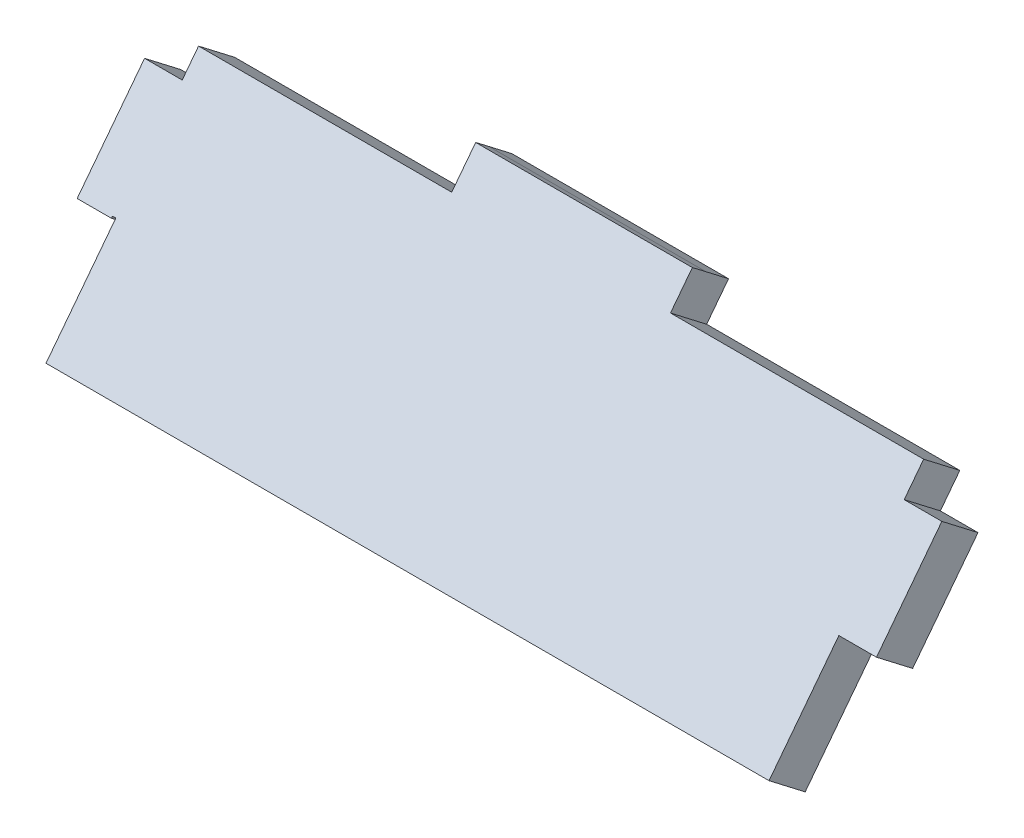
ISO-10303-21;
HEADER;
FILE_DESCRIPTION(('STEP AP214'),'2;1');
FILE_NAME('part.step','',(''),(''),'','','');
FILE_SCHEMA(('AUTOMOTIVE_DESIGN { 1 0 10303 214 1 1 1 1 }'));
ENDSEC;
DATA;
#1=APPLICATION_CONTEXT('core data for automotive mechanical design processes');
#2=APPLICATION_PROTOCOL_DEFINITION('international standard','automotive_design',2000,#1);
#3=PRODUCT_CONTEXT('',#1,'mechanical');
#4=PRODUCT('Part','Part','',(#3));
#5=PRODUCT_RELATED_PRODUCT_CATEGORY('part','',(#4));
#6=PRODUCT_DEFINITION_FORMATION('','',#4);
#7=PRODUCT_DEFINITION_CONTEXT('part definition',#1,'design');
#8=PRODUCT_DEFINITION('design','',#6,#7);
#9=PRODUCT_DEFINITION_SHAPE('','',#8);
#10=(LENGTH_UNIT() NAMED_UNIT(*) SI_UNIT(.MILLI.,.METRE.));
#11=(NAMED_UNIT(*) PLANE_ANGLE_UNIT() SI_UNIT($,.RADIAN.));
#12=(NAMED_UNIT(*) SI_UNIT($,.STERADIAN.) SOLID_ANGLE_UNIT());
#13=UNCERTAINTY_MEASURE_WITH_UNIT(LENGTH_MEASURE(1.E-05),#10,'distance_accuracy_value','');
#14=(GEOMETRIC_REPRESENTATION_CONTEXT(3) GLOBAL_UNCERTAINTY_ASSIGNED_CONTEXT((#13)) GLOBAL_UNIT_ASSIGNED_CONTEXT((#10,
#11,#12)) REPRESENTATION_CONTEXT('',''));
#15=CARTESIAN_POINT('',(0.,0.,0.));
#16=DIRECTION('',(0.,0.,1.));
#17=DIRECTION('',(1.,0.,0.));
#18=AXIS2_PLACEMENT_3D('',#15,#16,#17);
#19=CARTESIAN_POINT('',(-285.200000000001,78.6438868512443,-60.4630387999879));
#20=DIRECTION('',(1.,0.,0.));
#21=DIRECTION('',(0.,0.,-1.));
#22=AXIS2_PLACEMENT_3D('',#19,#20,#21);
#23=PLANE('',#22);
#24=DIRECTION('',(0.,0.792781117452051,-0.609506439516005));
#25=VECTOR('',#24,1.);
#26=CARTESIAN_POINT('',(-285.200000000001,197.680360461686,94.3669391102944));
#27=LINE('',#26,#25);
#28=CARTESIAN_POINT('',(-285.200000000001,197.799277629303,94.275513144367));
#29=VERTEX_POINT('',#28);
#30=CARTESIAN_POINT('',(-285.200000000001,200.296538149277,92.3555678598922));
#31=VERTEX_POINT('',#30);
#32=EDGE_CURVE('E192',#29,#31,#27,.T.);
#33=ORIENTED_EDGE('',*,*,#32,.T.);
#34=DIRECTION('',(0.,-0.609506439516001,-0.792781117452054));
#35=VECTOR('',#34,1.);
#36=CARTESIAN_POINT('',(-285.200000000001,81.2600645388356,-62.4744100503903));
#37=LINE('',#36,#35);
#38=CARTESIAN_POINT('',(-285.200000000001,201.833533007389,94.3547272159438));
#39=VERTEX_POINT('',#38);
#40=EDGE_CURVE('E232',#39,#31,#37,.T.);
#41=ORIENTED_EDGE('',*,*,#40,.F.);
#42=CARTESIAN_POINT('',(-285.200000000001,4.97086643496067,245.706796954713));
#43=DIRECTION('',(1.,0.,0.));
#44=DIRECTION('',(0.,0.,-1.));
#45=AXIS2_PLACEMENT_3D('',#42,#43,#44);
#46=CIRCLE('',#45,248.319065929736);
#47=CARTESIAN_POINT('',(-285.200000000001,202.731075398266,95.5293743672744));
#48=VERTEX_POINT('',#47);
#49=EDGE_CURVE('E226',#48,#39,#46,.F.);
#50=ORIENTED_EDGE('',*,*,#49,.F.);
#51=DIRECTION('',(0.,0.792781117452051,-0.609506439516005));
#52=VECTOR('',#51,1.);
#53=CARTESIAN_POINT('',(-285.200000000001,200.11838621975,97.5380635801026));
#54=LINE('',#53,#52);
#55=CARTESIAN_POINT('',(-285.200000000001,200.237303387367,97.4466376141751));
#56=VERTEX_POINT('',#55);
#57=EDGE_CURVE('E203',#56,#48,#54,.T.);
#58=ORIENTED_EDGE('',*,*,#57,.F.);
#59=DIRECTION('',(0.,0.609506439516005,0.792781117452051));
#60=VECTOR('',#59,1.);
#61=CARTESIAN_POINT('',(-285.200000000001,197.799277629303,94.2755131443669));
#62=LINE('',#61,#60);
#63=EDGE_CURVE('E213',#29,#56,#62,.T.);
#64=ORIENTED_EDGE('',*,*,#63,.F.);
#65=EDGE_LOOP('',(#33,#41,#50,#58,#64));
#66=FACE_BOUND('',#65,.T.);
#67=ADVANCED_FACE('F41',(#66),#23,.T.);
#68=CARTESIAN_POINT('',(-304.199999999999,78.6438868512443,-60.4630387999879));
#69=DIRECTION('',(-1.,0.,0.));
#70=DIRECTION('',(0.,0.,1.));
#71=AXIS2_PLACEMENT_3D('',#68,#69,#70);
#72=PLANE('',#71);
#73=DIRECTION('',(0.,0.792781117452051,-0.609506439516005));
#74=VECTOR('',#73,1.);
#75=CARTESIAN_POINT('',(-304.199999999999,200.11838621975,97.5380635801026));
#76=LINE('',#75,#74);
#77=CARTESIAN_POINT('',(-304.199999999999,199.999469052132,97.6294895460299));
#78=VERTEX_POINT('',#77);
#79=CARTESIAN_POINT('',(-304.199999999999,202.731075398266,95.5293743672744));
#80=VERTEX_POINT('',#79);
#81=EDGE_CURVE('E195',#78,#80,#76,.T.);
#82=ORIENTED_EDGE('',*,*,#81,.T.);
#83=CARTESIAN_POINT('',(-304.199999999999,4.97086643496067,245.706796954713));
#84=DIRECTION('',(-1.,0.,0.));
#85=DIRECTION('',(0.,0.,1.));
#86=AXIS2_PLACEMENT_3D('',#83,#84,#85);
#87=CIRCLE('',#86,248.319065929736);
#88=CARTESIAN_POINT('',(-304.199999999999,201.833533007389,94.3547272159435));
#89=VERTEX_POINT('',#88);
#90=EDGE_CURVE('E50',#89,#80,#87,.F.);
#91=ORIENTED_EDGE('',*,*,#90,.F.);
#92=DIRECTION('',(0.,0.609506439516001,0.792781117452054));
#93=VECTOR('',#92,1.);
#94=CARTESIAN_POINT('',(-304.199999999999,81.2600645388356,-62.4744100503903));
#95=LINE('',#94,#93);
#96=CARTESIAN_POINT('',(-304.199999999999,200.296538149277,92.3555678598922));
#97=VERTEX_POINT('',#96);
#98=EDGE_CURVE('E11',#97,#89,#95,.T.);
#99=ORIENTED_EDGE('',*,*,#98,.F.);
#100=DIRECTION('',(0.,0.792781117452051,-0.609506439516005));
#101=VECTOR('',#100,1.);
#102=CARTESIAN_POINT('',(-304.199999999999,197.680360461686,94.3669391102944));
#103=LINE('',#102,#101);
#104=CARTESIAN_POINT('',(-304.199999999999,197.561443294068,94.4583650762217));
#105=VERTEX_POINT('',#104);
#106=EDGE_CURVE('E204',#105,#97,#103,.T.);
#107=ORIENTED_EDGE('',*,*,#106,.F.);
#108=DIRECTION('',(0.,-0.609506439516005,-0.792781117452051));
#109=VECTOR('',#108,1.);
#110=CARTESIAN_POINT('',(-304.199999999999,197.561443294068,94.4583650762217));
#111=LINE('',#110,#109);
#112=EDGE_CURVE('E185',#78,#105,#111,.T.);
#113=ORIENTED_EDGE('',*,*,#112,.F.);
#114=EDGE_LOOP('',(#82,#91,#99,#107,#113));
#115=FACE_BOUND('',#114,.T.);
#116=ADVANCED_FACE('F206',(#115),#72,.T.);
#117=CARTESIAN_POINT('',(-326.4,198.319486701697,99.2995092169303));
#118=DIRECTION('',(0.,0.792781117452053,-0.609506439516003));
#119=DIRECTION('',(0.,0.609506439516003,0.792781117452052));
#120=AXIS2_PLACEMENT_3D('',#117,#118,#119);
#121=PLANE('',#120);
#122=DIRECTION('',(1.,0.,0.));
#123=VECTOR('',#122,1.);
#124=CARTESIAN_POINT('',(-359.949570915867,195.698609011778,95.8905504118865));
#125=LINE('',#124,#123);
#126=CARTESIAN_POINT('',(-329.7,195.698609011778,95.8905504118865));
#127=VERTEX_POINT('',#126);
#128=CARTESIAN_POINT('',(-326.4,195.698609011778,95.8905504118865));
#129=VERTEX_POINT('',#128);
#130=EDGE_CURVE('E65',#127,#129,#125,.T.);
#131=ORIENTED_EDGE('',*,*,#130,.F.);
#132=DIRECTION('',(0.,0.609506439516003,0.792781117452052));
#133=VECTOR('',#132,1.);
#134=CARTESIAN_POINT('',(-329.7,198.319486701697,99.2995092169303));
#135=LINE('',#134,#133);
#136=CARTESIAN_POINT('',(-329.7,198.136634769842,99.0616748816947));
#137=VERTEX_POINT('',#136);
#138=EDGE_CURVE('E238',#127,#137,#135,.T.);
#139=ORIENTED_EDGE('',*,*,#138,.T.);
#140=DIRECTION('',(1.,0.,0.));
#141=VECTOR('',#140,1.);
#142=CARTESIAN_POINT('',(-359.949570915867,198.136634769842,99.0616748816947));
#143=LINE('',#142,#141);
#144=CARTESIAN_POINT('',(-326.4,198.136634769842,99.0616748816947));
#145=VERTEX_POINT('',#144);
#146=EDGE_CURVE('E290',#137,#145,#143,.T.);
#147=ORIENTED_EDGE('',*,*,#146,.T.);
#148=DIRECTION('',(0.,-0.609506439516003,-0.792781117452052));
#149=VECTOR('',#148,1.);
#150=CARTESIAN_POINT('',(-326.4,198.136634769842,99.0616748816947));
#151=LINE('',#150,#149);
#152=EDGE_CURVE('E217',#145,#129,#151,.T.);
#153=ORIENTED_EDGE('',*,*,#152,.T.);
#154=EDGE_LOOP('',(#131,#139,#147,#153));
#155=FACE_BOUND('',#154,.T.);
#156=ADVANCED_FACE('F350',(#155),#121,.T.);
#157=CARTESIAN_POINT('',(-326.4,187.825780240638,101.564928539956));
#158=DIRECTION('',(0.,-0.792781117452051,0.609506439516005));
#159=DIRECTION('',(0.,-0.609506439516005,-0.792781117452051));
#160=AXIS2_PLACEMENT_3D('',#157,#158,#159);
#161=PLANE('',#160);
#162=DIRECTION('',(-1.,0.,0.));
#163=VECTOR('',#162,1.);
#164=CARTESIAN_POINT('',(-359.949570915867,190.446657930557,104.973887345));
#165=LINE('',#164,#163);
#166=CARTESIAN_POINT('',(-326.7,190.446657930557,104.973887345));
#167=VERTEX_POINT('',#166);
#168=CARTESIAN_POINT('',(-329.7,190.446657930557,104.973887345));
#169=VERTEX_POINT('',#168);
#170=EDGE_CURVE('E293',#167,#169,#165,.T.);
#171=ORIENTED_EDGE('',*,*,#170,.T.);
#172=DIRECTION('',(0.,-0.609506439516005,-0.792781117452051));
#173=VECTOR('',#172,1.);
#174=CARTESIAN_POINT('',(-329.7,187.825780240638,101.564928539956));
#175=LINE('',#174,#173);
#176=CARTESIAN_POINT('',(-329.7,188.008632172493,101.802762875192));
#177=VERTEX_POINT('',#176);
#178=EDGE_CURVE('E235',#169,#177,#175,.T.);
#179=ORIENTED_EDGE('',*,*,#178,.T.);
#180=DIRECTION('',(-1.,0.,0.));
#181=VECTOR('',#180,1.);
#182=CARTESIAN_POINT('',(-359.949570915867,188.008632172493,101.802762875192));
#183=LINE('',#182,#181);
#184=CARTESIAN_POINT('',(-326.7,188.008632172493,101.802762875192));
#185=VERTEX_POINT('',#184);
#186=EDGE_CURVE('E278',#185,#177,#183,.T.);
#187=ORIENTED_EDGE('',*,*,#186,.F.);
#188=DIRECTION('',(0.,-0.609506439516005,-0.792781117452051));
#189=VECTOR('',#188,1.);
#190=CARTESIAN_POINT('',(-326.7,187.825780240638,101.564928539956));
#191=LINE('',#190,#189);
#192=EDGE_CURVE('E288',#167,#185,#191,.T.);
#193=ORIENTED_EDGE('',*,*,#192,.F.);
#194=EDGE_LOOP('',(#171,#179,#187,#193));
#195=FACE_BOUND('',#194,.T.);
#196=ADVANCED_FACE('F358',(#195),#161,.T.);
#197=CARTESIAN_POINT('',(-263.,187.944697408256,101.473502574029));
#198=DIRECTION('',(0.,0.792781117452051,-0.609506439516005));
#199=DIRECTION('',(0.,0.609506439516005,0.792781117452051));
#200=AXIS2_PLACEMENT_3D('',#197,#198,#199);
#201=PLANE('',#200);
#202=DIRECTION('',(0.,-0.609506439516005,-0.792781117452051));
#203=VECTOR('',#202,1.);
#204=CARTESIAN_POINT('',(-259.7,187.944697408256,101.473502574029));
#205=LINE('',#204,#203);
#206=CARTESIAN_POINT('',(-259.7,190.565575098175,104.882461379073));
#207=VERTEX_POINT('',#206);
#208=CARTESIAN_POINT('',(-259.7,188.127549340111,101.711336909264));
#209=VERTEX_POINT('',#208);
#210=EDGE_CURVE('E245',#207,#209,#205,.T.);
#211=ORIENTED_EDGE('',*,*,#210,.F.);
#212=DIRECTION('',(1.,0.,0.));
#213=VECTOR('',#212,1.);
#214=CARTESIAN_POINT('',(-359.949570915867,190.565575098175,104.882461379073));
#215=LINE('',#214,#213);
#216=CARTESIAN_POINT('',(-263.,190.565575098175,104.882461379073));
#217=VERTEX_POINT('',#216);
#218=EDGE_CURVE('E309',#217,#207,#215,.T.);
#219=ORIENTED_EDGE('',*,*,#218,.F.);
#220=DIRECTION('',(0.,0.609506439516005,0.792781117452051));
#221=VECTOR('',#220,1.);
#222=CARTESIAN_POINT('',(-263.,187.944697408256,101.473502574029));
#223=LINE('',#222,#221);
#224=CARTESIAN_POINT('',(-263.,188.127549340111,101.711336909264));
#225=VERTEX_POINT('',#224);
#226=EDGE_CURVE('E300',#225,#217,#223,.T.);
#227=ORIENTED_EDGE('',*,*,#226,.F.);
#228=DIRECTION('',(1.,0.,0.));
#229=VECTOR('',#228,1.);
#230=CARTESIAN_POINT('',(-359.949570915867,188.127549340111,101.711336909264));
#231=LINE('',#230,#229);
#232=EDGE_CURVE('E313',#225,#209,#231,.T.);
#233=ORIENTED_EDGE('',*,*,#232,.T.);
#234=EDGE_LOOP('',(#211,#219,#227,#233));
#235=FACE_BOUND('',#234,.T.);
#236=ADVANCED_FACE('F381',(#235),#201,.F.);
#237=CARTESIAN_POINT('',(-263.,198.200569534079,99.3909351828577));
#238=DIRECTION('',(0.,-0.792781117452053,0.609506439516003));
#239=DIRECTION('',(0.,-0.609506439516003,-0.792781117452052));
#240=AXIS2_PLACEMENT_3D('',#237,#238,#239);
#241=PLANE('',#240);
#242=DIRECTION('',(0.,0.609506439516003,0.792781117452052));
#243=VECTOR('',#242,1.);
#244=CARTESIAN_POINT('',(-259.7,198.200569534079,99.3909351828577));
#245=LINE('',#244,#243);
#246=CARTESIAN_POINT('',(-259.7,195.57969184416,95.9819763778139));
#247=VERTEX_POINT('',#246);
#248=CARTESIAN_POINT('',(-259.7,198.017717602224,99.1531008476221));
#249=VERTEX_POINT('',#248);
#250=EDGE_CURVE('E243',#247,#249,#245,.T.);
#251=ORIENTED_EDGE('',*,*,#250,.F.);
#252=DIRECTION('',(-1.,0.,0.));
#253=VECTOR('',#252,1.);
#254=CARTESIAN_POINT('',(-359.949570915867,195.57969184416,95.9819763778139));
#255=LINE('',#254,#253);
#256=CARTESIAN_POINT('',(-263.,195.57969184416,95.9819763778139));
#257=VERTEX_POINT('',#256);
#258=EDGE_CURVE('E310',#247,#257,#255,.T.);
#259=ORIENTED_EDGE('',*,*,#258,.T.);
#260=DIRECTION('',(0.,-0.609506439516003,-0.792781117452052));
#261=VECTOR('',#260,1.);
#262=CARTESIAN_POINT('',(-263.,198.200569534079,99.3909351828577));
#263=LINE('',#262,#261);
#264=CARTESIAN_POINT('',(-263.,198.017717602224,99.1531008476221));
#265=VERTEX_POINT('',#264);
#266=EDGE_CURVE('E315',#265,#257,#263,.T.);
#267=ORIENTED_EDGE('',*,*,#266,.F.);
#268=DIRECTION('',(-1.,0.,0.));
#269=VECTOR('',#268,1.);
#270=CARTESIAN_POINT('',(-359.949570915867,198.017717602224,99.1531008476221));
#271=LINE('',#270,#269);
#272=EDGE_CURVE('E307',#249,#265,#271,.T.);
#273=ORIENTED_EDGE('',*,*,#272,.F.);
#274=EDGE_LOOP('',(#251,#259,#267,#273));
#275=FACE_BOUND('',#274,.T.);
#276=ADVANCED_FACE('F389',(#275),#241,.F.);
#277=CARTESIAN_POINT('',(-359.949570915867,180.163446617174,107.834302993772));
#278=DIRECTION('',(0.,-0.609506439516005,-0.79278111745205));
#279=DIRECTION('',(0.,0.792781117452051,-0.609506439516005));
#280=AXIS2_PLACEMENT_3D('',#277,#278,#279);
#281=PLANE('',#280);
#282=DIRECTION('',(-1.,0.,0.));
#283=VECTOR('',#282,1.);
#284=CARTESIAN_POINT('',(-304.499999999999,197.561443294068,94.4583650762217));
#285=LINE('',#284,#283);
#286=CARTESIAN_POINT('',(-326.4,197.561443294068,94.4583650762217));
#287=VERTEX_POINT('',#286);
#288=EDGE_CURVE('E252',#105,#287,#285,.T.);
#289=ORIENTED_EDGE('',*,*,#288,.F.);
#290=ORIENTED_EDGE('',*,*,#106,.T.);
#291=DIRECTION('',(-1.,0.,0.));
#292=VECTOR('',#291,1.);
#293=CARTESIAN_POINT('',(-359.949570915867,200.296538149277,92.3555678598922));
#294=LINE('',#293,#292);
#295=EDGE_CURVE('E228',#31,#97,#294,.T.);
#296=ORIENTED_EDGE('',*,*,#295,.F.);
#297=ORIENTED_EDGE('',*,*,#32,.F.);
#298=DIRECTION('',(1.,0.,0.));
#299=VECTOR('',#298,1.);
#300=CARTESIAN_POINT('',(-284.900000000001,197.799277629303,94.2755131443669));
#301=LINE('',#300,#299);
#302=CARTESIAN_POINT('',(-263.,197.799277629303,94.2755131443669));
#303=VERTEX_POINT('',#302);
#304=EDGE_CURVE('E57',#29,#303,#301,.T.);
#305=ORIENTED_EDGE('',*,*,#304,.T.);
#306=DIRECTION('',(0.,-0.792781117452051,0.609506439516005));
#307=VECTOR('',#306,1.);
#308=CARTESIAN_POINT('',(-263.,180.163446617174,107.834302993772));
#309=LINE('',#308,#307);
#310=EDGE_CURVE('E328',#303,#257,#309,.T.);
#311=ORIENTED_EDGE('',*,*,#310,.T.);
#312=ORIENTED_EDGE('',*,*,#258,.F.);
#313=DIRECTION('',(0.,-0.792781117452051,0.609506439516005));
#314=VECTOR('',#313,1.);
#315=CARTESIAN_POINT('',(-259.7,180.163446617174,107.834302993772));
#316=LINE('',#315,#314);
#317=EDGE_CURVE('E331',#247,#209,#316,.T.);
#318=ORIENTED_EDGE('',*,*,#317,.T.);
#319=ORIENTED_EDGE('',*,*,#232,.F.);
#320=CARTESIAN_POINT('',(-263.,180.163446617174,107.834302993772));
#321=VERTEX_POINT('',#320);
#322=EDGE_CURVE('E314',#225,#321,#309,.T.);
#323=ORIENTED_EDGE('',*,*,#322,.T.);
#324=DIRECTION('',(1.,0.,0.));
#325=VECTOR('',#324,1.);
#326=CARTESIAN_POINT('',(-359.949570915867,180.163446617174,107.834302993772));
#327=LINE('',#326,#325);
#328=CARTESIAN_POINT('',(-326.4,180.163446617174,107.834302993772));
#329=VERTEX_POINT('',#328);
#330=EDGE_CURVE('E283',#329,#321,#327,.T.);
#331=ORIENTED_EDGE('',*,*,#330,.F.);
#332=DIRECTION('',(0.,0.792781117452051,-0.609506439516005));
#333=VECTOR('',#332,1.);
#334=CARTESIAN_POINT('',(-326.4,180.163446617174,107.834302993772));
#335=LINE('',#334,#333);
#336=CARTESIAN_POINT('',(-326.4,188.127549340111,101.711336909264));
#337=VERTEX_POINT('',#336);
#338=EDGE_CURVE('E276',#329,#337,#335,.T.);
#339=ORIENTED_EDGE('',*,*,#338,.T.);
#340=DIRECTION('',(1.,0.,0.));
#341=VECTOR('',#340,1.);
#342=CARTESIAN_POINT('',(-326.7,188.127549340111,101.711336909264));
#343=LINE('',#342,#341);
#344=CARTESIAN_POINT('',(-326.7,188.127549340111,101.711336909264));
#345=VERTEX_POINT('',#344);
#346=EDGE_CURVE('E267',#345,#337,#343,.T.);
#347=ORIENTED_EDGE('',*,*,#346,.F.);
#348=DIRECTION('',(0.,0.792781117452051,-0.609506439516005));
#349=VECTOR('',#348,1.);
#350=CARTESIAN_POINT('',(-326.7,180.163446617174,107.834302993772));
#351=LINE('',#350,#349);
#352=EDGE_CURVE('E264',#185,#345,#351,.T.);
#353=ORIENTED_EDGE('',*,*,#352,.F.);
#354=ORIENTED_EDGE('',*,*,#186,.T.);
#355=DIRECTION('',(0.,0.792781117452051,-0.609506439516005));
#356=VECTOR('',#355,1.);
#357=CARTESIAN_POINT('',(-329.7,180.163446617174,107.834302993772));
#358=LINE('',#357,#356);
#359=EDGE_CURVE('E275',#177,#127,#358,.T.);
#360=ORIENTED_EDGE('',*,*,#359,.T.);
#361=ORIENTED_EDGE('',*,*,#130,.T.);
#362=EDGE_CURVE('E280',#129,#287,#335,.T.);
#363=ORIENTED_EDGE('',*,*,#362,.T.);
#364=EDGE_LOOP('',(#289,#290,#296,#297,#305,#311,#312,#318,#319,#323,#331,#339,#347,#353,#354,
#360,#361,#363));
#365=FACE_BOUND('',#364,.T.);
#366=ADVANCED_FACE('F342',(#365),#281,.T.);
#367=CARTESIAN_POINT('',(0.,200.11838621975,97.5380635801026));
#368=DIRECTION('',(0.,0.609506439516005,0.792781117452051));
#369=DIRECTION('',(0.,-0.792781117452051,0.609506439516005));
#370=AXIS2_PLACEMENT_3D('',#367,#368,#369);
#371=PLANE('',#370);
#372=ORIENTED_EDGE('',*,*,#81,.F.);
#373=DIRECTION('',(-1.,0.,0.));
#374=VECTOR('',#373,1.);
#375=CARTESIAN_POINT('',(-359.949570915867,199.999469052132,97.6294895460299));
#376=LINE('',#375,#374);
#377=CARTESIAN_POINT('',(-326.4,199.999469052132,97.6294895460299));
#378=VERTEX_POINT('',#377);
#379=EDGE_CURVE('E180',#78,#378,#376,.T.);
#380=ORIENTED_EDGE('',*,*,#379,.T.);
#381=DIRECTION('',(0.,-0.792781117452051,0.609506439516005));
#382=VECTOR('',#381,1.);
#383=CARTESIAN_POINT('',(-326.4,182.601472375238,111.00542746358));
#384=LINE('',#383,#382);
#385=EDGE_CURVE('E286',#378,#145,#384,.T.);
#386=ORIENTED_EDGE('',*,*,#385,.T.);
#387=ORIENTED_EDGE('',*,*,#146,.F.);
#388=DIRECTION('',(0.,0.792781117452051,-0.609506439516005));
#389=VECTOR('',#388,1.);
#390=CARTESIAN_POINT('',(-329.7,182.601472375238,111.00542746358));
#391=LINE('',#390,#389);
#392=EDGE_CURVE('E241',#169,#137,#391,.T.);
#393=ORIENTED_EDGE('',*,*,#392,.F.);
#394=ORIENTED_EDGE('',*,*,#170,.F.);
#395=DIRECTION('',(0.,0.792781117452051,-0.609506439516005));
#396=VECTOR('',#395,1.);
#397=CARTESIAN_POINT('',(-326.7,182.601472375238,111.00542746358));
#398=LINE('',#397,#396);
#399=CARTESIAN_POINT('',(-326.7,190.565575098175,104.882461379073));
#400=VERTEX_POINT('',#399);
#401=EDGE_CURVE('E272',#167,#400,#398,.T.);
#402=ORIENTED_EDGE('',*,*,#401,.T.);
#403=DIRECTION('',(1.,0.,0.));
#404=VECTOR('',#403,1.);
#405=CARTESIAN_POINT('',(-326.7,190.565575098175,104.882461379073));
#406=LINE('',#405,#404);
#407=CARTESIAN_POINT('',(-326.4,190.565575098175,104.882461379073));
#408=VERTEX_POINT('',#407);
#409=EDGE_CURVE('E268',#400,#408,#406,.T.);
#410=ORIENTED_EDGE('',*,*,#409,.T.);
#411=DIRECTION('',(0.,-0.792781117452051,0.609506439516005));
#412=VECTOR('',#411,1.);
#413=CARTESIAN_POINT('',(-326.4,182.601472375238,111.00542746358));
#414=LINE('',#413,#412);
#415=CARTESIAN_POINT('',(-326.4,182.601472375238,111.00542746358));
#416=VERTEX_POINT('',#415);
#417=EDGE_CURVE('E256',#408,#416,#414,.T.);
#418=ORIENTED_EDGE('',*,*,#417,.T.);
#419=DIRECTION('',(1.,0.,0.));
#420=VECTOR('',#419,1.);
#421=CARTESIAN_POINT('',(-359.949570915867,182.601472375238,111.00542746358));
#422=LINE('',#421,#420);
#423=CARTESIAN_POINT('',(-263.,182.601472375238,111.00542746358));
#424=VERTEX_POINT('',#423);
#425=EDGE_CURVE('E302',#416,#424,#422,.T.);
#426=ORIENTED_EDGE('',*,*,#425,.T.);
#427=DIRECTION('',(0.,0.792781117452051,-0.609506439516005));
#428=VECTOR('',#427,1.);
#429=CARTESIAN_POINT('',(-263.,182.601472375238,111.00542746358));
#430=LINE('',#429,#428);
#431=EDGE_CURVE('E305',#424,#217,#430,.T.);
#432=ORIENTED_EDGE('',*,*,#431,.T.);
#433=ORIENTED_EDGE('',*,*,#218,.T.);
#434=DIRECTION('',(0.,-0.792781117452051,0.609506439516005));
#435=VECTOR('',#434,1.);
#436=CARTESIAN_POINT('',(-259.7,182.601472375238,111.00542746358));
#437=LINE('',#436,#435);
#438=EDGE_CURVE('E247',#249,#207,#437,.T.);
#439=ORIENTED_EDGE('',*,*,#438,.F.);
#440=ORIENTED_EDGE('',*,*,#272,.T.);
#441=DIRECTION('',(0.,0.792781117452051,-0.609506439516005));
#442=VECTOR('',#441,1.);
#443=CARTESIAN_POINT('',(-263.,182.601472375238,111.00542746358));
#444=LINE('',#443,#442);
#445=CARTESIAN_POINT('',(-263.,200.237303387367,97.4466376141751));
#446=VERTEX_POINT('',#445);
#447=EDGE_CURVE('E295',#265,#446,#444,.T.);
#448=ORIENTED_EDGE('',*,*,#447,.T.);
#449=DIRECTION('',(-1.,0.,0.));
#450=VECTOR('',#449,1.);
#451=CARTESIAN_POINT('',(-263.,200.237303387367,97.4466376141751));
#452=LINE('',#451,#450);
#453=EDGE_CURVE('E210',#446,#56,#452,.T.);
#454=ORIENTED_EDGE('',*,*,#453,.T.);
#455=ORIENTED_EDGE('',*,*,#57,.T.);
#456=DIRECTION('',(1.,0.,0.));
#457=VECTOR('',#456,1.);
#458=CARTESIAN_POINT('',(-330.701333630157,202.731075398266,95.5293743672744));
#459=LINE('',#458,#457);
#460=EDGE_CURVE('E198',#80,#48,#459,.T.);
#461=ORIENTED_EDGE('',*,*,#460,.F.);
#462=EDGE_LOOP('',(#372,#380,#386,#387,#393,#394,#402,#410,#418,#426,#432,#433,#439,#440,#448,
#454,#455,#461));
#463=FACE_BOUND('',#462,.T.);
#464=ADVANCED_FACE('F196',(#463),#371,.T.);
#465=CARTESIAN_POINT('',(-304.499999999999,200.182320983987,97.8673238812655));
#466=DIRECTION('',(0.,-0.792781117452051,0.609506439516005));
#467=DIRECTION('',(0.,-0.609506439516005,-0.792781117452051));
#468=AXIS2_PLACEMENT_3D('',#465,#466,#467);
#469=PLANE('',#468);
#470=ORIENTED_EDGE('',*,*,#379,.F.);
#471=ORIENTED_EDGE('',*,*,#112,.T.);
#472=ORIENTED_EDGE('',*,*,#288,.T.);
#473=DIRECTION('',(0.,-0.609506439516005,-0.792781117452051));
#474=VECTOR('',#473,1.);
#475=CARTESIAN_POINT('',(-326.4,200.182320983987,97.8673238812655));
#476=LINE('',#475,#474);
#477=EDGE_CURVE('E187',#378,#287,#476,.T.);
#478=ORIENTED_EDGE('',*,*,#477,.F.);
#479=EDGE_LOOP('',(#470,#471,#472,#478));
#480=FACE_BOUND('',#479,.T.);
#481=ADVANCED_FACE('F182',(#480),#469,.F.);
#482=CARTESIAN_POINT('',(-326.4,0.,0.));
#483=DIRECTION('',(1.,0.,0.));
#484=DIRECTION('',(0.,0.,-1.));
#485=AXIS2_PLACEMENT_3D('',#482,#483,#484);
#486=PLANE('',#485);
#487=ORIENTED_EDGE('',*,*,#362,.F.);
#488=ORIENTED_EDGE('',*,*,#152,.F.);
#489=ORIENTED_EDGE('',*,*,#385,.F.);
#490=ORIENTED_EDGE('',*,*,#477,.T.);
#491=EDGE_LOOP('',(#487,#488,#489,#490));
#492=FACE_BOUND('',#491,.T.);
#493=ADVANCED_FACE('F344',(#492),#486,.F.);
#494=CARTESIAN_POINT('',(-326.7,191.340533523751,169.454269424816));
#495=DIRECTION('',(-1.,0.,0.));
#496=DIRECTION('',(0.,0.,1.));
#497=AXIS2_PLACEMENT_3D('',#494,#495,#496);
#498=PLANE('',#497);
#499=ORIENTED_EDGE('',*,*,#192,.T.);
#500=ORIENTED_EDGE('',*,*,#352,.T.);
#501=DIRECTION('',(0.,0.609506439516005,0.792781117452051));
#502=VECTOR('',#501,1.);
#503=CARTESIAN_POINT('',(-326.7,188.127549340111,101.711336909264));
#504=LINE('',#503,#502);
#505=EDGE_CURVE('E261',#345,#400,#504,.T.);
#506=ORIENTED_EDGE('',*,*,#505,.T.);
#507=ORIENTED_EDGE('',*,*,#401,.F.);
#508=EDGE_LOOP('',(#499,#500,#506,#507));
#509=FACE_BOUND('',#508,.T.);
#510=ADVANCED_FACE('F361',(#509),#498,.F.);
#511=CARTESIAN_POINT('',(-326.7,188.127549340111,101.711336909264));
#512=DIRECTION('',(0.,0.792781117452051,-0.609506439516005));
#513=DIRECTION('',(0.,0.609506439516005,0.792781117452051));
#514=AXIS2_PLACEMENT_3D('',#511,#512,#513);
#515=PLANE('',#514);
#516=DIRECTION('',(0.,0.609506439516005,0.792781117452051));
#517=VECTOR('',#516,1.);
#518=CARTESIAN_POINT('',(-326.4,188.127549340111,101.711336909264));
#519=LINE('',#518,#517);
#520=EDGE_CURVE('E263',#337,#408,#519,.T.);
#521=ORIENTED_EDGE('',*,*,#520,.T.);
#522=ORIENTED_EDGE('',*,*,#409,.F.);
#523=ORIENTED_EDGE('',*,*,#505,.F.);
#524=ORIENTED_EDGE('',*,*,#346,.T.);
#525=EDGE_LOOP('',(#521,#522,#523,#524));
#526=FACE_BOUND('',#525,.T.);
#527=ADVANCED_FACE('F364',(#526),#515,.F.);
#528=CARTESIAN_POINT('',(-326.4,0.,0.));
#529=DIRECTION('',(1.,0.,0.));
#530=DIRECTION('',(0.,0.,-1.));
#531=AXIS2_PLACEMENT_3D('',#528,#529,#530);
#532=PLANE('',#531);
#533=ORIENTED_EDGE('',*,*,#417,.F.);
#534=ORIENTED_EDGE('',*,*,#520,.F.);
#535=ORIENTED_EDGE('',*,*,#338,.F.);
#536=DIRECTION('',(0.,-0.609506439516004,-0.792781117452052));
#537=VECTOR('',#536,1.);
#538=CARTESIAN_POINT('',(-326.4,182.601472375238,111.00542746358));
#539=LINE('',#538,#537);
#540=EDGE_CURVE('E271',#416,#329,#539,.T.);
#541=ORIENTED_EDGE('',*,*,#540,.F.);
#542=EDGE_LOOP('',(#533,#534,#535,#541));
#543=FACE_BOUND('',#542,.T.);
#544=ADVANCED_FACE('F367',(#543),#532,.F.);
#545=CARTESIAN_POINT('',(-359.949570915867,182.601472375238,111.00542746358));
#546=DIRECTION('',(0.,-0.792781117452052,0.609506439516004));
#547=DIRECTION('',(0.,-0.609506439516004,-0.792781117452052));
#548=AXIS2_PLACEMENT_3D('',#545,#546,#547);
#549=PLANE('',#548);
#550=ORIENTED_EDGE('',*,*,#425,.F.);
#551=ORIENTED_EDGE('',*,*,#540,.T.);
#552=ORIENTED_EDGE('',*,*,#330,.T.);
#553=DIRECTION('',(0.,0.609506439516004,0.792781117452052));
#554=VECTOR('',#553,1.);
#555=CARTESIAN_POINT('',(-263.,182.601472375238,111.00542746358));
#556=LINE('',#555,#554);
#557=EDGE_CURVE('E279',#321,#424,#556,.T.);
#558=ORIENTED_EDGE('',*,*,#557,.T.);
#559=EDGE_LOOP('',(#550,#551,#552,#558));
#560=FACE_BOUND('',#559,.T.);
#561=ADVANCED_FACE('F376',(#560),#549,.T.);
#562=CARTESIAN_POINT('',(-263.,0.,0.));
#563=DIRECTION('',(-1.,0.,0.));
#564=DIRECTION('',(0.,0.,1.));
#565=AXIS2_PLACEMENT_3D('',#562,#563,#564);
#566=PLANE('',#565);
#567=ORIENTED_EDGE('',*,*,#431,.F.);
#568=ORIENTED_EDGE('',*,*,#557,.F.);
#569=ORIENTED_EDGE('',*,*,#322,.F.);
#570=ORIENTED_EDGE('',*,*,#226,.T.);
#571=EDGE_LOOP('',(#567,#568,#569,#570));
#572=FACE_BOUND('',#571,.T.);
#573=ADVANCED_FACE('F43',(#572),#566,.F.);
#574=CARTESIAN_POINT('',(-263.,0.,0.));
#575=DIRECTION('',(-1.,0.,0.));
#576=DIRECTION('',(0.,0.,1.));
#577=AXIS2_PLACEMENT_3D('',#574,#575,#576);
#578=PLANE('',#577);
#579=DIRECTION('',(0.,-0.609506439516005,-0.792781117452051));
#580=VECTOR('',#579,1.);
#581=CARTESIAN_POINT('',(-263.,200.420155319222,97.6844719494107));
#582=LINE('',#581,#580);
#583=EDGE_CURVE('E250',#446,#303,#582,.T.);
#584=ORIENTED_EDGE('',*,*,#583,.F.);
#585=ORIENTED_EDGE('',*,*,#447,.F.);
#586=ORIENTED_EDGE('',*,*,#266,.T.);
#587=ORIENTED_EDGE('',*,*,#310,.F.);
#588=EDGE_LOOP('',(#584,#585,#586,#587));
#589=FACE_BOUND('',#588,.T.);
#590=ADVANCED_FACE('F394',(#589),#578,.F.);
#591=CARTESIAN_POINT('',(-284.900000000001,200.420155319222,97.6844719494107));
#592=DIRECTION('',(0.,0.792781117452051,-0.609506439516005));
#593=DIRECTION('',(0.,0.609506439516005,0.792781117452051));
#594=AXIS2_PLACEMENT_3D('',#591,#592,#593);
#595=PLANE('',#594);
#596=ORIENTED_EDGE('',*,*,#304,.F.);
#597=ORIENTED_EDGE('',*,*,#63,.T.);
#598=ORIENTED_EDGE('',*,*,#453,.F.);
#599=ORIENTED_EDGE('',*,*,#583,.T.);
#600=EDGE_LOOP('',(#596,#597,#598,#599));
#601=FACE_BOUND('',#600,.T.);
#602=ADVANCED_FACE('F396',(#601),#595,.T.);
#603=CARTESIAN_POINT('',(-329.7,-103.5,-190.868386440488));
#604=DIRECTION('',(-1.,0.,0.));
#605=DIRECTION('',(0.,0.,1.));
#606=AXIS2_PLACEMENT_3D('',#603,#604,#605);
#607=PLANE('',#606);
#608=ORIENTED_EDGE('',*,*,#392,.T.);
#609=ORIENTED_EDGE('',*,*,#138,.F.);
#610=ORIENTED_EDGE('',*,*,#359,.F.);
#611=ORIENTED_EDGE('',*,*,#178,.F.);
#612=EDGE_LOOP('',(#608,#609,#610,#611));
#613=FACE_BOUND('',#612,.T.);
#614=ADVANCED_FACE('F352',(#613),#607,.T.);
#615=CARTESIAN_POINT('',(-259.7,-103.5,575.412895232632));
#616=DIRECTION('',(1.,0.,0.));
#617=DIRECTION('',(0.,0.,-1.));
#618=AXIS2_PLACEMENT_3D('',#615,#616,#617);
#619=PLANE('',#618);
#620=ORIENTED_EDGE('',*,*,#438,.T.);
#621=ORIENTED_EDGE('',*,*,#210,.T.);
#622=ORIENTED_EDGE('',*,*,#317,.F.);
#623=ORIENTED_EDGE('',*,*,#250,.T.);
#624=EDGE_LOOP('',(#620,#621,#622,#623));
#625=FACE_BOUND('',#624,.T.);
#626=ADVANCED_FACE('F492',(#625),#619,.T.);
#627=CARTESIAN_POINT('',(-330.701333630157,201.833533007389,94.3547272159438));
#628=DIRECTION('',(0.,-0.792781117452054,0.609506439516001));
#629=DIRECTION('',(0.,-0.609506439516001,-0.792781117452054));
#630=AXIS2_PLACEMENT_3D('',#627,#628,#629);
#631=PLANE('',#630);
#632=ORIENTED_EDGE('',*,*,#40,.T.);
#633=ORIENTED_EDGE('',*,*,#295,.T.);
#634=ORIENTED_EDGE('',*,*,#98,.T.);
#635=DIRECTION('',(1.,0.,0.));
#636=VECTOR('',#635,1.);
#637=CARTESIAN_POINT('',(-330.701333630157,201.833533007389,94.3547272159438));
#638=LINE('',#637,#636);
#639=EDGE_CURVE('E220',#89,#39,#638,.T.);
#640=ORIENTED_EDGE('',*,*,#639,.T.);
#641=EDGE_LOOP('',(#632,#633,#634,#640));
#642=FACE_BOUND('',#641,.T.);
#643=ADVANCED_FACE('F338',(#642),#631,.F.);
#644=CARTESIAN_POINT('',(-330.701333630157,4.97086643496067,245.706796954713));
#645=DIRECTION('',(1.,0.,0.));
#646=DIRECTION('',(0.,0.,-1.));
#647=AXIS2_PLACEMENT_3D('',#644,#645,#646);
#648=CYLINDRICAL_SURFACE('',#647,248.319065929736);
#649=ORIENTED_EDGE('',*,*,#49,.T.);
#650=ORIENTED_EDGE('',*,*,#639,.F.);
#651=ORIENTED_EDGE('',*,*,#90,.T.);
#652=ORIENTED_EDGE('',*,*,#460,.T.);
#653=EDGE_LOOP('',(#649,#650,#651,#652));
#654=FACE_BOUND('',#653,.T.);
#655=ADVANCED_FACE('F335',(#654),#648,.T.);
#656=CLOSED_SHELL('',(#67,#116,#156,#196,#236,#276,#366,#464,#481,#493,#510,#527,#544,#561,#573,
#590,#602,#614,#626,#643,#655));
#657=MANIFOLD_SOLID_BREP('B2',#656);
#658=ADVANCED_BREP_SHAPE_REPRESENTATION('',(#18,#657),#14);
#659=SHAPE_DEFINITION_REPRESENTATION(#9,#658);
ENDSEC;
END-ISO-10303-21;
